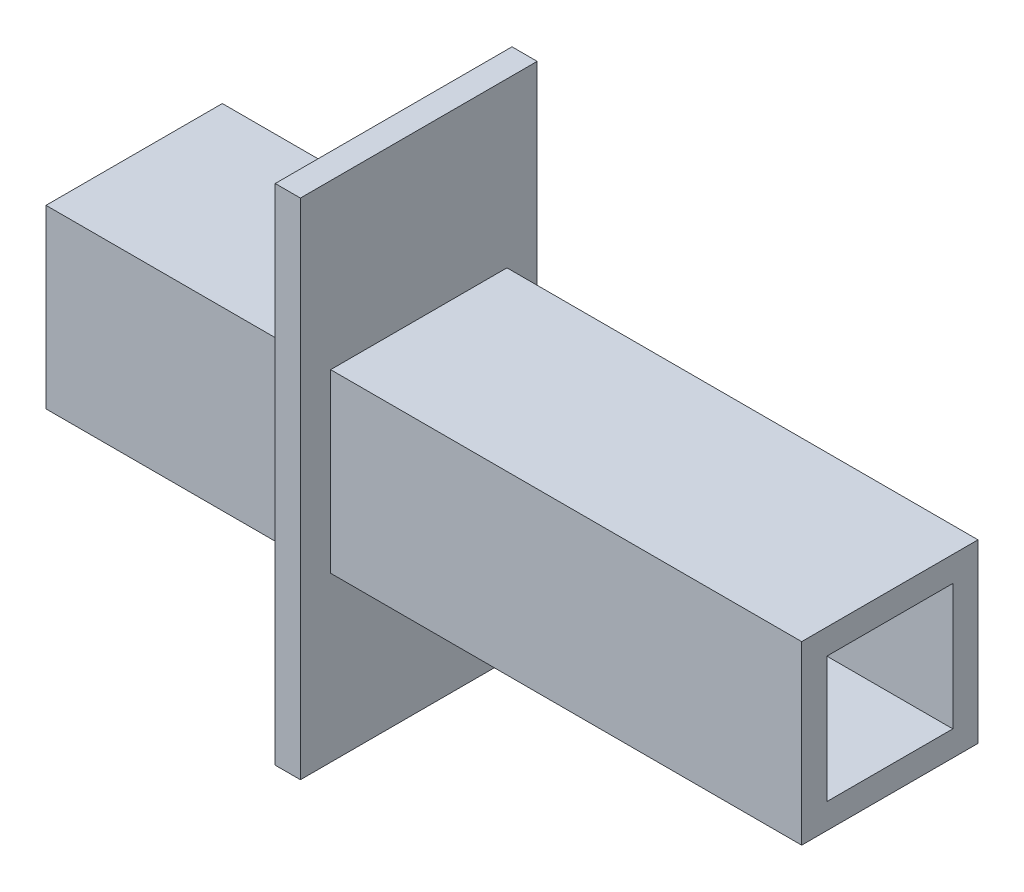
ISO-10303-21;
HEADER;
FILE_DESCRIPTION(('STEP AP214'),'2;1');
FILE_NAME('part.step','',(''),(''),'','','');
FILE_SCHEMA(('AUTOMOTIVE_DESIGN { 1 0 10303 214 1 1 1 1 }'));
ENDSEC;
DATA;
#1=APPLICATION_CONTEXT('core data for automotive mechanical design processes');
#2=APPLICATION_PROTOCOL_DEFINITION('international standard','automotive_design',2000,#1);
#3=PRODUCT_CONTEXT('',#1,'mechanical');
#4=PRODUCT('Part','Part','',(#3));
#5=PRODUCT_RELATED_PRODUCT_CATEGORY('part','',(#4));
#6=PRODUCT_DEFINITION_FORMATION('','',#4);
#7=PRODUCT_DEFINITION_CONTEXT('part definition',#1,'design');
#8=PRODUCT_DEFINITION('design','',#6,#7);
#9=PRODUCT_DEFINITION_SHAPE('','',#8);
#10=(LENGTH_UNIT() NAMED_UNIT(*) SI_UNIT(.MILLI.,.METRE.));
#11=(NAMED_UNIT(*) PLANE_ANGLE_UNIT() SI_UNIT($,.RADIAN.));
#12=(NAMED_UNIT(*) SI_UNIT($,.STERADIAN.) SOLID_ANGLE_UNIT());
#13=UNCERTAINTY_MEASURE_WITH_UNIT(LENGTH_MEASURE(1.E-05),#10,'distance_accuracy_value','');
#14=(GEOMETRIC_REPRESENTATION_CONTEXT(3) GLOBAL_UNCERTAINTY_ASSIGNED_CONTEXT((#13)) GLOBAL_UNIT_ASSIGNED_CONTEXT((#10,
#11,#12)) REPRESENTATION_CONTEXT('',''));
#15=CARTESIAN_POINT('',(0.,0.,0.));
#16=DIRECTION('',(0.,0.,1.));
#17=DIRECTION('',(1.,0.,0.));
#18=AXIS2_PLACEMENT_3D('',#15,#16,#17);
#19=CARTESIAN_POINT('',(15.,0.,1.75));
#20=DIRECTION('',(0.,0.,-1.));
#21=DIRECTION('',(0.,1.,0.));
#22=AXIS2_PLACEMENT_3D('',#19,#20,#21);
#23=PLANE('',#22);
#24=DIRECTION('',(0.,1.,0.));
#25=VECTOR('',#24,1.);
#26=CARTESIAN_POINT('',(5.65,0.,1.75));
#27=LINE('',#26,#25);
#28=CARTESIAN_POINT('',(5.65,0.,1.75));
#29=VERTEX_POINT('',#28);
#30=CARTESIAN_POINT('',(5.65,3.5,1.75));
#31=VERTEX_POINT('',#30);
#32=EDGE_CURVE('E64',#29,#31,#27,.T.);
#33=ORIENTED_EDGE('',*,*,#32,.F.);
#34=DIRECTION('',(-1.,0.,0.));
#35=VECTOR('',#34,1.);
#36=CARTESIAN_POINT('',(15.,0.,1.75));
#37=LINE('',#36,#35);
#38=CARTESIAN_POINT('',(15.,0.,1.75));
#39=VERTEX_POINT('',#38);
#40=EDGE_CURVE('E274',#39,#29,#37,.T.);
#41=ORIENTED_EDGE('',*,*,#40,.F.);
#42=DIRECTION('',(0.,-1.,0.));
#43=VECTOR('',#42,1.);
#44=CARTESIAN_POINT('',(15.,0.,1.75));
#45=LINE('',#44,#43);
#46=CARTESIAN_POINT('',(15.,3.5,1.75));
#47=VERTEX_POINT('',#46);
#48=EDGE_CURVE('E243',#47,#39,#45,.T.);
#49=ORIENTED_EDGE('',*,*,#48,.F.);
#50=DIRECTION('',(-1.,0.,0.));
#51=VECTOR('',#50,1.);
#52=CARTESIAN_POINT('',(15.,3.5,1.75));
#53=LINE('',#52,#51);
#54=EDGE_CURVE('E264',#47,#31,#53,.T.);
#55=ORIENTED_EDGE('',*,*,#54,.T.);
#56=EDGE_LOOP('',(#33,#41,#49,#55));
#57=FACE_BOUND('',#56,.T.);
#58=ADVANCED_FACE('F41',(#57),#23,.F.);
#59=CARTESIAN_POINT('',(15.,0.,1.75));
#60=DIRECTION('',(0.,1.,0.));
#61=DIRECTION('',(0.,0.,1.));
#62=AXIS2_PLACEMENT_3D('',#59,#60,#61);
#63=PLANE('',#62);
#64=DIRECTION('',(0.,0.,1.));
#65=VECTOR('',#64,1.);
#66=CARTESIAN_POINT('',(5.65,0.,1.75));
#67=LINE('',#66,#65);
#68=CARTESIAN_POINT('',(5.65,0.,-1.75));
#69=VERTEX_POINT('',#68);
#70=EDGE_CURVE('E238',#69,#29,#67,.T.);
#71=ORIENTED_EDGE('',*,*,#70,.F.);
#72=DIRECTION('',(-1.,0.,0.));
#73=VECTOR('',#72,1.);
#74=CARTESIAN_POINT('',(15.,0.,-1.75));
#75=LINE('',#74,#73);
#76=CARTESIAN_POINT('',(15.,0.,-1.75));
#77=VERTEX_POINT('',#76);
#78=EDGE_CURVE('E270',#77,#69,#75,.T.);
#79=ORIENTED_EDGE('',*,*,#78,.F.);
#80=DIRECTION('',(0.,0.,-1.));
#81=VECTOR('',#80,1.);
#82=CARTESIAN_POINT('',(15.,0.,1.75));
#83=LINE('',#82,#81);
#84=EDGE_CURVE('E246',#39,#77,#83,.T.);
#85=ORIENTED_EDGE('',*,*,#84,.F.);
#86=ORIENTED_EDGE('',*,*,#40,.T.);
#87=EDGE_LOOP('',(#71,#79,#85,#86));
#88=FACE_BOUND('',#87,.T.);
#89=ADVANCED_FACE('F296',(#88),#63,.F.);
#90=CARTESIAN_POINT('',(15.,0.,-1.75));
#91=DIRECTION('',(0.,0.,1.));
#92=DIRECTION('',(0.,-1.,0.));
#93=AXIS2_PLACEMENT_3D('',#90,#91,#92);
#94=PLANE('',#93);
#95=DIRECTION('',(0.,-1.,0.));
#96=VECTOR('',#95,1.);
#97=CARTESIAN_POINT('',(5.65,0.,-1.75));
#98=LINE('',#97,#96);
#99=CARTESIAN_POINT('',(5.65,3.5,-1.75));
#100=VERTEX_POINT('',#99);
#101=EDGE_CURVE('E235',#100,#69,#98,.T.);
#102=ORIENTED_EDGE('',*,*,#101,.F.);
#103=DIRECTION('',(-1.,0.,0.));
#104=VECTOR('',#103,1.);
#105=CARTESIAN_POINT('',(15.,3.5,-1.75));
#106=LINE('',#105,#104);
#107=CARTESIAN_POINT('',(15.,3.5,-1.75));
#108=VERTEX_POINT('',#107);
#109=EDGE_CURVE('E267',#108,#100,#106,.T.);
#110=ORIENTED_EDGE('',*,*,#109,.F.);
#111=DIRECTION('',(0.,1.,0.));
#112=VECTOR('',#111,1.);
#113=CARTESIAN_POINT('',(15.,0.,-1.75));
#114=LINE('',#113,#112);
#115=EDGE_CURVE('E249',#77,#108,#114,.T.);
#116=ORIENTED_EDGE('',*,*,#115,.F.);
#117=ORIENTED_EDGE('',*,*,#78,.T.);
#118=EDGE_LOOP('',(#102,#110,#116,#117));
#119=FACE_BOUND('',#118,.T.);
#120=ADVANCED_FACE('F302',(#119),#94,.F.);
#121=CARTESIAN_POINT('',(15.,3.5,1.75));
#122=DIRECTION('',(0.,-1.,0.));
#123=DIRECTION('',(0.,0.,-1.));
#124=AXIS2_PLACEMENT_3D('',#121,#122,#123);
#125=PLANE('',#124);
#126=DIRECTION('',(0.,0.,-1.));
#127=VECTOR('',#126,1.);
#128=CARTESIAN_POINT('',(5.65,3.5,1.75));
#129=LINE('',#128,#127);
#130=EDGE_CURVE('E11',#31,#100,#129,.T.);
#131=ORIENTED_EDGE('',*,*,#130,.F.);
#132=ORIENTED_EDGE('',*,*,#54,.F.);
#133=DIRECTION('',(0.,0.,1.));
#134=VECTOR('',#133,1.);
#135=CARTESIAN_POINT('',(15.,3.5,1.75));
#136=LINE('',#135,#134);
#137=EDGE_CURVE('E251',#108,#47,#136,.T.);
#138=ORIENTED_EDGE('',*,*,#137,.F.);
#139=ORIENTED_EDGE('',*,*,#109,.T.);
#140=EDGE_LOOP('',(#131,#132,#138,#139));
#141=FACE_BOUND('',#140,.T.);
#142=ADVANCED_FACE('F324',(#141),#125,.F.);
#143=CARTESIAN_POINT('',(15.,0.,0.));
#144=DIRECTION('',(-1.,0.,0.));
#145=DIRECTION('',(0.,0.,1.));
#146=AXIS2_PLACEMENT_3D('',#143,#144,#145);
#147=PLANE('',#146);
#148=DIRECTION('',(0.,0.,-1.));
#149=VECTOR('',#148,1.);
#150=CARTESIAN_POINT('',(15.,0.500000000000001,1.25));
#151=LINE('',#150,#149);
#152=CARTESIAN_POINT('',(15.,0.500000000000001,1.25));
#153=VERTEX_POINT('',#152);
#154=CARTESIAN_POINT('',(15.,0.500000000000001,-1.25));
#155=VERTEX_POINT('',#154);
#156=EDGE_CURVE('E185',#153,#155,#151,.T.);
#157=ORIENTED_EDGE('',*,*,#156,.F.);
#158=DIRECTION('',(0.,-1.,0.));
#159=VECTOR('',#158,1.);
#160=CARTESIAN_POINT('',(15.,3.,1.25));
#161=LINE('',#160,#159);
#162=CARTESIAN_POINT('',(15.,3.,1.25));
#163=VERTEX_POINT('',#162);
#164=EDGE_CURVE('E56',#163,#153,#161,.T.);
#165=ORIENTED_EDGE('',*,*,#164,.F.);
#166=DIRECTION('',(0.,0.,1.));
#167=VECTOR('',#166,1.);
#168=CARTESIAN_POINT('',(15.,3.,1.25));
#169=LINE('',#168,#167);
#170=CARTESIAN_POINT('',(15.,3.,-1.25));
#171=VERTEX_POINT('',#170);
#172=EDGE_CURVE('E176',#171,#163,#169,.T.);
#173=ORIENTED_EDGE('',*,*,#172,.F.);
#174=DIRECTION('',(0.,1.,0.));
#175=VECTOR('',#174,1.);
#176=CARTESIAN_POINT('',(15.,3.,-1.25));
#177=LINE('',#176,#175);
#178=EDGE_CURVE('E179',#155,#171,#177,.T.);
#179=ORIENTED_EDGE('',*,*,#178,.F.);
#180=EDGE_LOOP('',(#157,#165,#173,#179));
#181=FACE_BOUND('',#180,.T.);
#182=ORIENTED_EDGE('',*,*,#48,.T.);
#183=ORIENTED_EDGE('',*,*,#84,.T.);
#184=ORIENTED_EDGE('',*,*,#115,.T.);
#185=ORIENTED_EDGE('',*,*,#137,.T.);
#186=EDGE_LOOP('',(#182,#183,#184,#185));
#187=FACE_BOUND('',#186,.T.);
#188=ADVANCED_FACE('F332',(#181,#187),#147,.F.);
#189=CARTESIAN_POINT('',(5.65,0.,0.));
#190=DIRECTION('',(-1.,0.,0.));
#191=DIRECTION('',(0.,0.,1.));
#192=AXIS2_PLACEMENT_3D('',#189,#190,#191);
#193=PLANE('',#192);
#194=DIRECTION('',(0.,-1.,0.));
#195=VECTOR('',#194,1.);
#196=CARTESIAN_POINT('',(5.65,6.75,-2.35));
#197=LINE('',#196,#195);
#198=CARTESIAN_POINT('',(5.65,6.75,-2.35));
#199=VERTEX_POINT('',#198);
#200=CARTESIAN_POINT('',(5.65,-3.25,-2.35));
#201=VERTEX_POINT('',#200);
#202=EDGE_CURVE('E195',#199,#201,#197,.T.);
#203=ORIENTED_EDGE('',*,*,#202,.F.);
#204=DIRECTION('',(0.,0.,-1.));
#205=VECTOR('',#204,1.);
#206=CARTESIAN_POINT('',(5.65,6.75,-2.35));
#207=LINE('',#206,#205);
#208=CARTESIAN_POINT('',(5.65,6.75,2.35));
#209=VERTEX_POINT('',#208);
#210=EDGE_CURVE('E205',#209,#199,#207,.T.);
#211=ORIENTED_EDGE('',*,*,#210,.F.);
#212=DIRECTION('',(0.,1.,0.));
#213=VECTOR('',#212,1.);
#214=CARTESIAN_POINT('',(5.65,6.75,2.35));
#215=LINE('',#214,#213);
#216=CARTESIAN_POINT('',(5.65,-3.25,2.35));
#217=VERTEX_POINT('',#216);
#218=EDGE_CURVE('E202',#217,#209,#215,.T.);
#219=ORIENTED_EDGE('',*,*,#218,.F.);
#220=DIRECTION('',(0.,0.,1.));
#221=VECTOR('',#220,1.);
#222=CARTESIAN_POINT('',(5.65,-3.25,-2.35));
#223=LINE('',#222,#221);
#224=EDGE_CURVE('E198',#201,#217,#223,.T.);
#225=ORIENTED_EDGE('',*,*,#224,.F.);
#226=EDGE_LOOP('',(#203,#211,#219,#225));
#227=FACE_BOUND('',#226,.T.);
#228=ORIENTED_EDGE('',*,*,#70,.T.);
#229=ORIENTED_EDGE('',*,*,#32,.T.);
#230=ORIENTED_EDGE('',*,*,#130,.T.);
#231=ORIENTED_EDGE('',*,*,#101,.T.);
#232=EDGE_LOOP('',(#228,#229,#230,#231));
#233=FACE_BOUND('',#232,.T.);
#234=ADVANCED_FACE('F338',(#227,#233),#193,.F.);
#235=CARTESIAN_POINT('',(5.15,0.,0.));
#236=DIRECTION('',(-1.,0.,0.));
#237=DIRECTION('',(0.,0.,1.));
#238=AXIS2_PLACEMENT_3D('',#235,#236,#237);
#239=PLANE('',#238);
#240=DIRECTION('',(0.,-1.,0.));
#241=VECTOR('',#240,1.);
#242=CARTESIAN_POINT('',(5.15,6.75,-2.35));
#243=LINE('',#242,#241);
#244=CARTESIAN_POINT('',(5.15,6.75,-2.35));
#245=VERTEX_POINT('',#244);
#246=CARTESIAN_POINT('',(5.15,-3.25,-2.35));
#247=VERTEX_POINT('',#246);
#248=EDGE_CURVE('E191',#245,#247,#243,.T.);
#249=ORIENTED_EDGE('',*,*,#248,.T.);
#250=DIRECTION('',(0.,0.,1.));
#251=VECTOR('',#250,1.);
#252=CARTESIAN_POINT('',(5.15,-3.25,-2.35));
#253=LINE('',#252,#251);
#254=CARTESIAN_POINT('',(5.15,-3.25,2.35));
#255=VERTEX_POINT('',#254);
#256=EDGE_CURVE('E211',#247,#255,#253,.T.);
#257=ORIENTED_EDGE('',*,*,#256,.T.);
#258=DIRECTION('',(0.,1.,0.));
#259=VECTOR('',#258,1.);
#260=CARTESIAN_POINT('',(5.15,6.75,2.35));
#261=LINE('',#260,#259);
#262=CARTESIAN_POINT('',(5.15,6.75,2.35));
#263=VERTEX_POINT('',#262);
#264=EDGE_CURVE('E214',#255,#263,#261,.T.);
#265=ORIENTED_EDGE('',*,*,#264,.T.);
#266=DIRECTION('',(0.,0.,-1.));
#267=VECTOR('',#266,1.);
#268=CARTESIAN_POINT('',(5.15,6.75,-2.35));
#269=LINE('',#268,#267);
#270=EDGE_CURVE('E199',#263,#245,#269,.T.);
#271=ORIENTED_EDGE('',*,*,#270,.T.);
#272=EDGE_LOOP('',(#249,#257,#265,#271));
#273=FACE_BOUND('',#272,.T.);
#274=DIRECTION('',(0.,1.,0.));
#275=VECTOR('',#274,1.);
#276=CARTESIAN_POINT('',(5.15,0.,1.75));
#277=LINE('',#276,#275);
#278=CARTESIAN_POINT('',(5.15,0.,1.75));
#279=VERTEX_POINT('',#278);
#280=CARTESIAN_POINT('',(5.15,3.5,1.75));
#281=VERTEX_POINT('',#280);
#282=EDGE_CURVE('E232',#279,#281,#277,.T.);
#283=ORIENTED_EDGE('',*,*,#282,.F.);
#284=DIRECTION('',(0.,0.,1.));
#285=VECTOR('',#284,1.);
#286=CARTESIAN_POINT('',(5.15,0.,1.75));
#287=LINE('',#286,#285);
#288=CARTESIAN_POINT('',(5.15,0.,-1.75));
#289=VERTEX_POINT('',#288);
#290=EDGE_CURVE('E229',#289,#279,#287,.T.);
#291=ORIENTED_EDGE('',*,*,#290,.F.);
#292=DIRECTION('',(0.,-1.,0.));
#293=VECTOR('',#292,1.);
#294=CARTESIAN_POINT('',(5.15,0.,-1.75));
#295=LINE('',#294,#293);
#296=CARTESIAN_POINT('',(5.15,3.5,-1.75));
#297=VERTEX_POINT('',#296);
#298=EDGE_CURVE('E221',#297,#289,#295,.T.);
#299=ORIENTED_EDGE('',*,*,#298,.F.);
#300=DIRECTION('',(0.,0.,-1.));
#301=VECTOR('',#300,1.);
#302=CARTESIAN_POINT('',(5.15,3.5,1.75));
#303=LINE('',#302,#301);
#304=EDGE_CURVE('E49',#281,#297,#303,.T.);
#305=ORIENTED_EDGE('',*,*,#304,.F.);
#306=EDGE_LOOP('',(#283,#291,#299,#305));
#307=FACE_BOUND('',#306,.T.);
#308=ADVANCED_FACE('F292',(#273,#307),#239,.T.);
#309=CARTESIAN_POINT('',(5.65,6.75,-2.35));
#310=DIRECTION('',(0.,0.,-1.));
#311=DIRECTION('',(0.,1.,0.));
#312=AXIS2_PLACEMENT_3D('',#309,#310,#311);
#313=PLANE('',#312);
#314=ORIENTED_EDGE('',*,*,#248,.F.);
#315=DIRECTION('',(-1.,0.,0.));
#316=VECTOR('',#315,1.);
#317=CARTESIAN_POINT('',(5.65,6.75,-2.35));
#318=LINE('',#317,#316);
#319=EDGE_CURVE('E219',#199,#245,#318,.T.);
#320=ORIENTED_EDGE('',*,*,#319,.F.);
#321=ORIENTED_EDGE('',*,*,#202,.T.);
#322=DIRECTION('',(-1.,0.,0.));
#323=VECTOR('',#322,1.);
#324=CARTESIAN_POINT('',(5.65,-3.25,-2.35));
#325=LINE('',#324,#323);
#326=EDGE_CURVE('E208',#201,#247,#325,.T.);
#327=ORIENTED_EDGE('',*,*,#326,.T.);
#328=EDGE_LOOP('',(#314,#320,#321,#327));
#329=FACE_BOUND('',#328,.T.);
#330=ADVANCED_FACE('F349',(#329),#313,.T.);
#331=CARTESIAN_POINT('',(5.65,6.75,-2.35));
#332=DIRECTION('',(0.,1.,0.));
#333=DIRECTION('',(0.,0.,1.));
#334=AXIS2_PLACEMENT_3D('',#331,#332,#333);
#335=PLANE('',#334);
#336=ORIENTED_EDGE('',*,*,#270,.F.);
#337=DIRECTION('',(-1.,0.,0.));
#338=VECTOR('',#337,1.);
#339=CARTESIAN_POINT('',(5.65,6.75,2.35));
#340=LINE('',#339,#338);
#341=EDGE_CURVE('E222',#209,#263,#340,.T.);
#342=ORIENTED_EDGE('',*,*,#341,.F.);
#343=ORIENTED_EDGE('',*,*,#210,.T.);
#344=ORIENTED_EDGE('',*,*,#319,.T.);
#345=EDGE_LOOP('',(#336,#342,#343,#344));
#346=FACE_BOUND('',#345,.T.);
#347=ADVANCED_FACE('F358',(#346),#335,.T.);
#348=CARTESIAN_POINT('',(5.65,6.75,2.35));
#349=DIRECTION('',(0.,0.,1.));
#350=DIRECTION('',(0.,-1.,0.));
#351=AXIS2_PLACEMENT_3D('',#348,#349,#350);
#352=PLANE('',#351);
#353=ORIENTED_EDGE('',*,*,#264,.F.);
#354=DIRECTION('',(-1.,0.,0.));
#355=VECTOR('',#354,1.);
#356=CARTESIAN_POINT('',(5.65,-3.25,2.35));
#357=LINE('',#356,#355);
#358=EDGE_CURVE('E224',#217,#255,#357,.T.);
#359=ORIENTED_EDGE('',*,*,#358,.F.);
#360=ORIENTED_EDGE('',*,*,#218,.T.);
#361=ORIENTED_EDGE('',*,*,#341,.T.);
#362=EDGE_LOOP('',(#353,#359,#360,#361));
#363=FACE_BOUND('',#362,.T.);
#364=ADVANCED_FACE('F367',(#363),#352,.T.);
#365=CARTESIAN_POINT('',(5.65,-3.25,-2.35));
#366=DIRECTION('',(0.,-1.,0.));
#367=DIRECTION('',(0.,0.,-1.));
#368=AXIS2_PLACEMENT_3D('',#365,#366,#367);
#369=PLANE('',#368);
#370=ORIENTED_EDGE('',*,*,#256,.F.);
#371=ORIENTED_EDGE('',*,*,#326,.F.);
#372=ORIENTED_EDGE('',*,*,#224,.T.);
#373=ORIENTED_EDGE('',*,*,#358,.T.);
#374=EDGE_LOOP('',(#370,#371,#372,#373));
#375=FACE_BOUND('',#374,.T.);
#376=ADVANCED_FACE('F376',(#375),#369,.T.);
#377=CARTESIAN_POINT('',(0.,0.,0.));
#378=DIRECTION('',(-1.,0.,0.));
#379=DIRECTION('',(0.,0.,1.));
#380=AXIS2_PLACEMENT_3D('',#377,#378,#379);
#381=PLANE('',#380);
#382=DIRECTION('',(0.,-1.,0.));
#383=VECTOR('',#382,1.);
#384=CARTESIAN_POINT('',(0.,0.,1.75));
#385=LINE('',#384,#383);
#386=CARTESIAN_POINT('',(0.,3.5,1.75));
#387=VERTEX_POINT('',#386);
#388=CARTESIAN_POINT('',(0.,0.,1.75));
#389=VERTEX_POINT('',#388);
#390=EDGE_CURVE('E242',#387,#389,#385,.T.);
#391=ORIENTED_EDGE('',*,*,#390,.F.);
#392=DIRECTION('',(0.,0.,1.));
#393=VECTOR('',#392,1.);
#394=CARTESIAN_POINT('',(0.,3.5,1.75));
#395=LINE('',#394,#393);
#396=CARTESIAN_POINT('',(0.,3.5,-1.75));
#397=VERTEX_POINT('',#396);
#398=EDGE_CURVE('E247',#397,#387,#395,.T.);
#399=ORIENTED_EDGE('',*,*,#398,.F.);
#400=DIRECTION('',(0.,1.,0.));
#401=VECTOR('',#400,1.);
#402=CARTESIAN_POINT('',(0.,0.,-1.75));
#403=LINE('',#402,#401);
#404=CARTESIAN_POINT('',(0.,0.,-1.75));
#405=VERTEX_POINT('',#404);
#406=EDGE_CURVE('E259',#405,#397,#403,.T.);
#407=ORIENTED_EDGE('',*,*,#406,.F.);
#408=DIRECTION('',(0.,0.,-1.));
#409=VECTOR('',#408,1.);
#410=CARTESIAN_POINT('',(0.,0.,1.75));
#411=LINE('',#410,#409);
#412=EDGE_CURVE('E256',#389,#405,#411,.T.);
#413=ORIENTED_EDGE('',*,*,#412,.F.);
#414=EDGE_LOOP('',(#391,#399,#407,#413));
#415=FACE_BOUND('',#414,.T.);
#416=ADVANCED_FACE('F289',(#415),#381,.T.);
#417=EDGE_CURVE('E253',#281,#387,#53,.T.);
#418=ORIENTED_EDGE('',*,*,#417,.F.);
#419=ORIENTED_EDGE('',*,*,#304,.T.);
#420=EDGE_CURVE('E266',#297,#397,#106,.T.);
#421=ORIENTED_EDGE('',*,*,#420,.T.);
#422=ORIENTED_EDGE('',*,*,#398,.T.);
#423=EDGE_LOOP('',(#418,#419,#421,#422));
#424=FACE_BOUND('',#423,.T.);
#425=ADVANCED_FACE('F279',(#424),#125,.F.);
#426=ORIENTED_EDGE('',*,*,#420,.F.);
#427=ORIENTED_EDGE('',*,*,#298,.T.);
#428=EDGE_CURVE('E269',#289,#405,#75,.T.);
#429=ORIENTED_EDGE('',*,*,#428,.T.);
#430=ORIENTED_EDGE('',*,*,#406,.T.);
#431=EDGE_LOOP('',(#426,#427,#429,#430));
#432=FACE_BOUND('',#431,.T.);
#433=ADVANCED_FACE('F282',(#432),#94,.F.);
#434=ORIENTED_EDGE('',*,*,#428,.F.);
#435=ORIENTED_EDGE('',*,*,#290,.T.);
#436=EDGE_CURVE('E273',#279,#389,#37,.T.);
#437=ORIENTED_EDGE('',*,*,#436,.T.);
#438=ORIENTED_EDGE('',*,*,#412,.T.);
#439=EDGE_LOOP('',(#434,#435,#437,#438));
#440=FACE_BOUND('',#439,.T.);
#441=ADVANCED_FACE('F294',(#440),#63,.F.);
#442=ORIENTED_EDGE('',*,*,#436,.F.);
#443=ORIENTED_EDGE('',*,*,#282,.T.);
#444=ORIENTED_EDGE('',*,*,#417,.T.);
#445=ORIENTED_EDGE('',*,*,#390,.T.);
#446=EDGE_LOOP('',(#442,#443,#444,#445));
#447=FACE_BOUND('',#446,.T.);
#448=ADVANCED_FACE('F43',(#447),#23,.F.);
#449=CARTESIAN_POINT('',(0.999999999999997,3.,1.25));
#450=DIRECTION('',(0.,0.,1.));
#451=DIRECTION('',(0.,-1.,0.));
#452=AXIS2_PLACEMENT_3D('',#449,#450,#451);
#453=PLANE('',#452);
#454=ORIENTED_EDGE('',*,*,#164,.T.);
#455=DIRECTION('',(1.,0.,0.));
#456=VECTOR('',#455,1.);
#457=CARTESIAN_POINT('',(0.999999999999997,0.500000000000001,1.25));
#458=LINE('',#457,#456);
#459=CARTESIAN_POINT('',(0.999999999999997,0.500000000000001,1.25));
#460=VERTEX_POINT('',#459);
#461=EDGE_CURVE('E154',#460,#153,#458,.T.);
#462=ORIENTED_EDGE('',*,*,#461,.F.);
#463=DIRECTION('',(0.,-1.,0.));
#464=VECTOR('',#463,1.);
#465=CARTESIAN_POINT('',(0.999999999999997,3.,1.25));
#466=LINE('',#465,#464);
#467=CARTESIAN_POINT('',(0.999999999999997,3.,1.25));
#468=VERTEX_POINT('',#467);
#469=EDGE_CURVE('E158',#468,#460,#466,.T.);
#470=ORIENTED_EDGE('',*,*,#469,.F.);
#471=DIRECTION('',(1.,0.,0.));
#472=VECTOR('',#471,1.);
#473=CARTESIAN_POINT('',(0.999999999999997,3.,1.25));
#474=LINE('',#473,#472);
#475=EDGE_CURVE('E189',#468,#163,#474,.T.);
#476=ORIENTED_EDGE('',*,*,#475,.T.);
#477=EDGE_LOOP('',(#454,#462,#470,#476));
#478=FACE_BOUND('',#477,.T.);
#479=ADVANCED_FACE('F156',(#478),#453,.F.);
#480=CARTESIAN_POINT('',(0.999999999999997,3.,1.25));
#481=DIRECTION('',(0.,1.,0.));
#482=DIRECTION('',(0.,0.,1.));
#483=AXIS2_PLACEMENT_3D('',#480,#481,#482);
#484=PLANE('',#483);
#485=ORIENTED_EDGE('',*,*,#172,.T.);
#486=ORIENTED_EDGE('',*,*,#475,.F.);
#487=DIRECTION('',(0.,0.,1.));
#488=VECTOR('',#487,1.);
#489=CARTESIAN_POINT('',(0.999999999999997,3.,1.25));
#490=LINE('',#489,#488);
#491=CARTESIAN_POINT('',(0.999999999999997,3.,-1.25));
#492=VERTEX_POINT('',#491);
#493=EDGE_CURVE('E164',#492,#468,#490,.T.);
#494=ORIENTED_EDGE('',*,*,#493,.F.);
#495=DIRECTION('',(1.,0.,0.));
#496=VECTOR('',#495,1.);
#497=CARTESIAN_POINT('',(0.999999999999997,3.,-1.25));
#498=LINE('',#497,#496);
#499=EDGE_CURVE('E192',#492,#171,#498,.T.);
#500=ORIENTED_EDGE('',*,*,#499,.T.);
#501=EDGE_LOOP('',(#485,#486,#494,#500));
#502=FACE_BOUND('',#501,.T.);
#503=ADVANCED_FACE('F423',(#502),#484,.F.);
#504=CARTESIAN_POINT('',(0.999999999999997,3.,-1.25));
#505=DIRECTION('',(0.,0.,-1.));
#506=DIRECTION('',(0.,1.,0.));
#507=AXIS2_PLACEMENT_3D('',#504,#505,#506);
#508=PLANE('',#507);
#509=ORIENTED_EDGE('',*,*,#178,.T.);
#510=ORIENTED_EDGE('',*,*,#499,.F.);
#511=DIRECTION('',(0.,1.,0.));
#512=VECTOR('',#511,1.);
#513=CARTESIAN_POINT('',(0.999999999999997,3.,-1.25));
#514=LINE('',#513,#512);
#515=CARTESIAN_POINT('',(0.999999999999997,0.500000000000001,-1.25));
#516=VERTEX_POINT('',#515);
#517=EDGE_CURVE('E172',#516,#492,#514,.T.);
#518=ORIENTED_EDGE('',*,*,#517,.F.);
#519=DIRECTION('',(1.,0.,0.));
#520=VECTOR('',#519,1.);
#521=CARTESIAN_POINT('',(0.999999999999997,0.500000000000001,-1.25));
#522=LINE('',#521,#520);
#523=EDGE_CURVE('E163',#516,#155,#522,.T.);
#524=ORIENTED_EDGE('',*,*,#523,.T.);
#525=EDGE_LOOP('',(#509,#510,#518,#524));
#526=FACE_BOUND('',#525,.T.);
#527=ADVANCED_FACE('F431',(#526),#508,.F.);
#528=CARTESIAN_POINT('',(0.999999999999997,0.500000000000001,1.25));
#529=DIRECTION('',(0.,-1.,0.));
#530=DIRECTION('',(0.,0.,-1.));
#531=AXIS2_PLACEMENT_3D('',#528,#529,#530);
#532=PLANE('',#531);
#533=ORIENTED_EDGE('',*,*,#156,.T.);
#534=ORIENTED_EDGE('',*,*,#523,.F.);
#535=DIRECTION('',(0.,0.,-1.));
#536=VECTOR('',#535,1.);
#537=CARTESIAN_POINT('',(0.999999999999997,0.500000000000001,1.25));
#538=LINE('',#537,#536);
#539=EDGE_CURVE('E167',#460,#516,#538,.T.);
#540=ORIENTED_EDGE('',*,*,#539,.F.);
#541=ORIENTED_EDGE('',*,*,#461,.T.);
#542=EDGE_LOOP('',(#533,#534,#540,#541));
#543=FACE_BOUND('',#542,.T.);
#544=ADVANCED_FACE('F168',(#543),#532,.F.);
#545=CARTESIAN_POINT('',(0.999999999999997,0.,0.));
#546=DIRECTION('',(1.,0.,0.));
#547=DIRECTION('',(0.,0.,-1.));
#548=AXIS2_PLACEMENT_3D('',#545,#546,#547);
#549=PLANE('',#548);
#550=ORIENTED_EDGE('',*,*,#469,.T.);
#551=ORIENTED_EDGE('',*,*,#539,.T.);
#552=ORIENTED_EDGE('',*,*,#517,.T.);
#553=ORIENTED_EDGE('',*,*,#493,.T.);
#554=EDGE_LOOP('',(#550,#551,#552,#553));
#555=FACE_BOUND('',#554,.T.);
#556=ADVANCED_FACE('F174',(#555),#549,.T.);
#557=CLOSED_SHELL('',(#58,#89,#120,#142,#188,#234,#308,#330,#347,#364,#376,#416,#425,#433,#441,
#448,#479,#503,#527,#544,#556));
#558=MANIFOLD_SOLID_BREP('B2',#557);
#559=ADVANCED_BREP_SHAPE_REPRESENTATION('',(#18,#558),#14);
#560=SHAPE_DEFINITION_REPRESENTATION(#9,#559);
ENDSEC;
END-ISO-10303-21;
